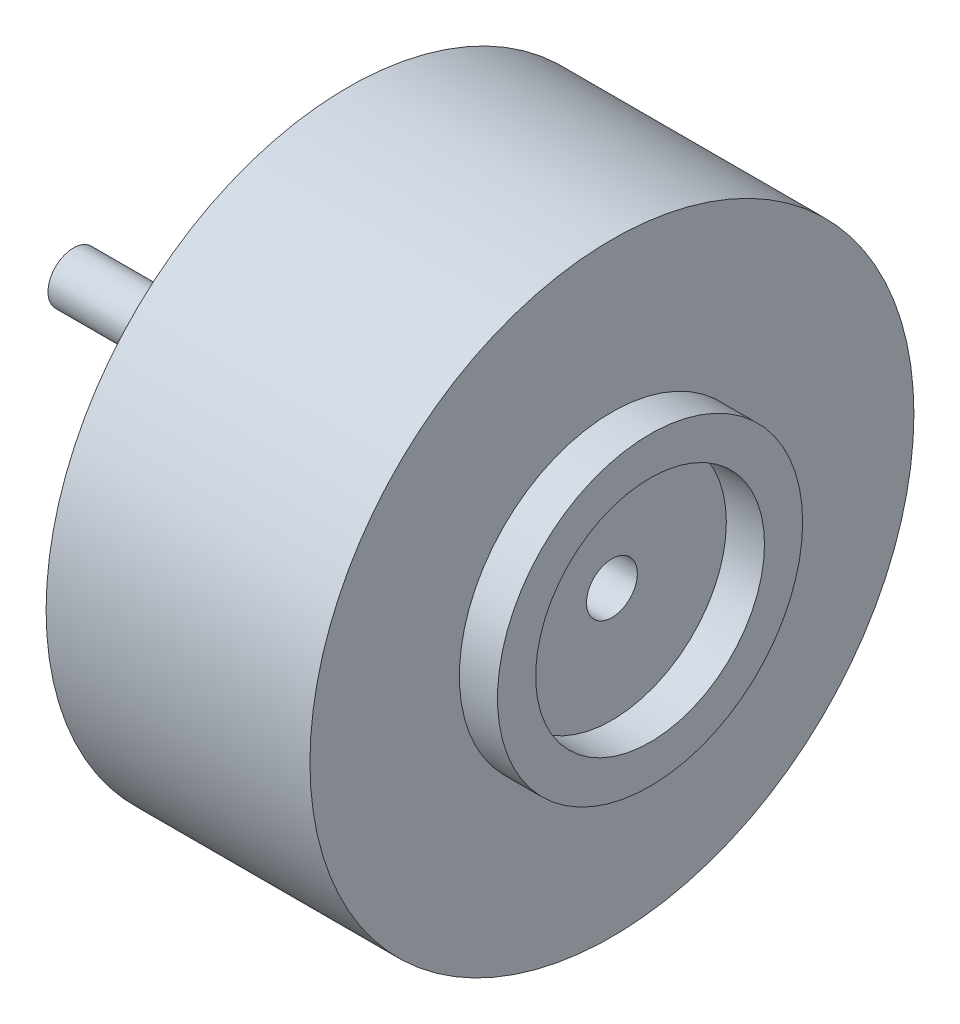
ISO-10303-21;
HEADER;
FILE_DESCRIPTION(('STEP AP214'),'2;1');
FILE_NAME('part.step','',(''),(''),'','','');
FILE_SCHEMA(('AUTOMOTIVE_DESIGN { 1 0 10303 214 1 1 1 1 }'));
ENDSEC;
DATA;
#1=APPLICATION_CONTEXT('core data for automotive mechanical design processes');
#2=APPLICATION_PROTOCOL_DEFINITION('international standard','automotive_design',2000,#1);
#3=PRODUCT_CONTEXT('',#1,'mechanical');
#4=PRODUCT('Part','Part','',(#3));
#5=PRODUCT_RELATED_PRODUCT_CATEGORY('part','',(#4));
#6=PRODUCT_DEFINITION_FORMATION('','',#4);
#7=PRODUCT_DEFINITION_CONTEXT('part definition',#1,'design');
#8=PRODUCT_DEFINITION('design','',#6,#7);
#9=PRODUCT_DEFINITION_SHAPE('','',#8);
#10=(LENGTH_UNIT() NAMED_UNIT(*) SI_UNIT(.MILLI.,.METRE.));
#11=(NAMED_UNIT(*) PLANE_ANGLE_UNIT() SI_UNIT($,.RADIAN.));
#12=(NAMED_UNIT(*) SI_UNIT($,.STERADIAN.) SOLID_ANGLE_UNIT());
#13=UNCERTAINTY_MEASURE_WITH_UNIT(LENGTH_MEASURE(1.E-05),#10,'distance_accuracy_value','');
#14=(GEOMETRIC_REPRESENTATION_CONTEXT(3) GLOBAL_UNCERTAINTY_ASSIGNED_CONTEXT((#13)) GLOBAL_UNIT_ASSIGNED_CONTEXT((#10,
#11,#12)) REPRESENTATION_CONTEXT('',''));
#15=CARTESIAN_POINT('',(0.,0.,0.));
#16=DIRECTION('',(0.,0.,1.));
#17=DIRECTION('',(1.,0.,0.));
#18=AXIS2_PLACEMENT_3D('',#15,#16,#17);
#19=CARTESIAN_POINT('',(-21.6,0.,0.));
#20=DIRECTION('',(1.,0.,0.));
#21=DIRECTION('',(0.,0.,-1.));
#22=AXIS2_PLACEMENT_3D('',#19,#20,#21);
#23=CYLINDRICAL_SURFACE('',#22,2.);
#24=CARTESIAN_POINT('',(-21.6,0.,0.));
#25=DIRECTION('',(1.,0.,0.));
#26=DIRECTION('',(0.,0.,-1.));
#27=AXIS2_PLACEMENT_3D('',#24,#25,#26);
#28=CIRCLE('',#27,2.);
#29=CARTESIAN_POINT('',(-21.6,0.,-2.));
#30=VERTEX_POINT('',#29);
#31=EDGE_CURVE('E11',#30,#30,#28,.T.);
#32=CARTESIAN_POINT('',(0.,0.,0.));
#33=DIRECTION('',(1.,0.,0.));
#34=DIRECTION('',(0.,0.,-1.));
#35=AXIS2_PLACEMENT_3D('',#32,#33,#34);
#36=CIRCLE('',#35,2.);
#37=CARTESIAN_POINT('',(0.,0.,-2.));
#38=VERTEX_POINT('',#37);
#39=EDGE_CURVE('E44',#38,#38,#36,.T.);
#40=CARTESIAN_POINT('',(-21.6,0.,-2.));
#41=CARTESIAN_POINT('',(-21.375,0.,-2.));
#42=CARTESIAN_POINT('',(-21.15,0.,-2.));
#43=CARTESIAN_POINT('',(-20.7,0.,-2.));
#44=CARTESIAN_POINT('',(-20.475,0.,-2.));
#45=CARTESIAN_POINT('',(-20.025,0.,-2.));
#46=CARTESIAN_POINT('',(-19.8,0.,-2.));
#47=CARTESIAN_POINT('',(-19.35,0.,-2.));
#48=CARTESIAN_POINT('',(-19.125,0.,-2.));
#49=CARTESIAN_POINT('',(-18.675,0.,-2.));
#50=CARTESIAN_POINT('',(-18.45,0.,-2.));
#51=CARTESIAN_POINT('',(-18.,0.,-2.));
#52=CARTESIAN_POINT('',(-17.775,0.,-2.));
#53=CARTESIAN_POINT('',(-17.325,0.,-2.));
#54=CARTESIAN_POINT('',(-17.1,0.,-2.));
#55=CARTESIAN_POINT('',(-16.65,0.,-2.));
#56=CARTESIAN_POINT('',(-16.425,0.,-2.));
#57=CARTESIAN_POINT('',(-15.975,0.,-2.));
#58=CARTESIAN_POINT('',(-15.75,0.,-2.));
#59=CARTESIAN_POINT('',(-15.3,0.,-2.));
#60=CARTESIAN_POINT('',(-15.075,0.,-2.));
#61=CARTESIAN_POINT('',(-14.625,0.,-2.));
#62=CARTESIAN_POINT('',(-14.4,0.,-2.));
#63=CARTESIAN_POINT('',(-13.95,0.,-2.));
#64=CARTESIAN_POINT('',(-13.725,0.,-2.));
#65=CARTESIAN_POINT('',(-13.275,0.,-2.));
#66=CARTESIAN_POINT('',(-13.05,0.,-2.));
#67=CARTESIAN_POINT('',(-12.6,0.,-2.));
#68=CARTESIAN_POINT('',(-12.375,0.,-2.));
#69=CARTESIAN_POINT('',(-11.925,0.,-2.));
#70=CARTESIAN_POINT('',(-11.7,0.,-2.));
#71=CARTESIAN_POINT('',(-11.25,0.,-2.));
#72=CARTESIAN_POINT('',(-11.025,0.,-2.));
#73=CARTESIAN_POINT('',(-10.575,0.,-2.));
#74=CARTESIAN_POINT('',(-10.35,0.,-2.));
#75=CARTESIAN_POINT('',(-9.9,0.,-2.));
#76=CARTESIAN_POINT('',(-9.675,0.,-2.));
#77=CARTESIAN_POINT('',(-9.225,0.,-2.));
#78=CARTESIAN_POINT('',(-9.,0.,-2.));
#79=CARTESIAN_POINT('',(-8.55,0.,-2.));
#80=CARTESIAN_POINT('',(-8.325,0.,-2.));
#81=CARTESIAN_POINT('',(-7.875,0.,-2.));
#82=CARTESIAN_POINT('',(-7.65,0.,-2.));
#83=CARTESIAN_POINT('',(-7.2,0.,-2.));
#84=CARTESIAN_POINT('',(-6.975,0.,-2.));
#85=CARTESIAN_POINT('',(-6.525,0.,-2.));
#86=CARTESIAN_POINT('',(-6.3,0.,-2.));
#87=CARTESIAN_POINT('',(-5.85,0.,-2.));
#88=CARTESIAN_POINT('',(-5.62500000000001,0.,-2.));
#89=CARTESIAN_POINT('',(-5.17500000000001,0.,-2.));
#90=CARTESIAN_POINT('',(-4.95,0.,-2.));
#91=CARTESIAN_POINT('',(-4.5,0.,-2.));
#92=CARTESIAN_POINT('',(-4.275,0.,-2.));
#93=CARTESIAN_POINT('',(-3.825,0.,-2.));
#94=CARTESIAN_POINT('',(-3.6,0.,-2.));
#95=CARTESIAN_POINT('',(-3.15,0.,-2.));
#96=CARTESIAN_POINT('',(-2.925,0.,-2.));
#97=CARTESIAN_POINT('',(-2.475,0.,-2.));
#98=CARTESIAN_POINT('',(-2.25,0.,-2.));
#99=CARTESIAN_POINT('',(-1.8,0.,-2.));
#100=CARTESIAN_POINT('',(-1.575,0.,-2.));
#101=CARTESIAN_POINT('',(-1.125,0.,-2.));
#102=CARTESIAN_POINT('',(-0.900000000000003,0.,-2.));
#103=CARTESIAN_POINT('',(-0.450000000000002,0.,-2.));
#104=CARTESIAN_POINT('',(-0.225000000000003,0.,-2.));
#105=CARTESIAN_POINT('',(0.,0.,-2.));
#106=B_SPLINE_CURVE_WITH_KNOTS('',3,(#40,#41,#42,#43,#44,#45,#46,#47,#48,#49,#50,#51,#52,#53,
#54,#55,#56,#57,#58,#59,#60,#61,#62,#63,#64,#65,#66,#67,#68,#69,#70,#71,#72,#73,#74,#75,#76,#77,
#78,#79,#80,#81,#82,#83,#84,#85,#86,#87,#88,#89,#90,#91,#92,#93,#94,#95,#96,#97,#98,#99,#100,
#101,#102,#103,#104,#105),.UNSPECIFIED.,.F.,.F.,(4,2,2,2,2,2,2,2,2,2,2,2,2,2,2,2,2,2,2,2,2,2,2,
2,2,2,2,2,2,2,2,2,4),(0.,0.674999999999998,1.35,2.025,2.7,3.375,4.05,4.725,5.4,6.075,6.75,7.425,
8.1,8.775,9.45,10.125,10.8,11.475,12.15,12.825,13.5,14.175,14.85,15.525,16.2,16.875,17.55,
18.225,18.9,19.575,20.25,20.925,21.6),.UNSPECIFIED.);
#107=EDGE_CURVE('BSEAM41',#30,#38,#106,.T.);
#108=ORIENTED_EDGE('',*,*,#31,.T.);
#109=ORIENTED_EDGE('',*,*,#39,.F.);
#110=ORIENTED_EDGE('',*,*,#107,.T.);
#111=ORIENTED_EDGE('',*,*,#107,.F.);
#112=EDGE_LOOP('',(#108,#110,#109,#111));
#113=FACE_BOUND('',#112,.T.);
#114=ADVANCED_FACE('F41',(#113),#23,.T.);
#115=CARTESIAN_POINT('',(-21.6,0.,0.));
#116=DIRECTION('',(1.,0.,0.));
#117=DIRECTION('',(0.,0.,-1.));
#118=AXIS2_PLACEMENT_3D('',#115,#116,#117);
#119=PLANE('',#118);
#120=CARTESIAN_POINT('',(-21.6,0.,0.));
#121=DIRECTION('',(1.,0.,0.));
#122=DIRECTION('',(0.,0.,-1.));
#123=AXIS2_PLACEMENT_3D('',#120,#121,#122);
#124=CIRCLE('',#123,1.);
#125=CARTESIAN_POINT('',(-21.6,0.,-1.));
#126=VERTEX_POINT('',#125);
#127=EDGE_CURVE('E51',#126,#126,#124,.T.);
#128=ORIENTED_EDGE('',*,*,#127,.T.);
#129=EDGE_LOOP('',(#128));
#130=FACE_BOUND('',#129,.T.);
#131=ORIENTED_EDGE('',*,*,#31,.F.);
#132=EDGE_LOOP('',(#131));
#133=FACE_BOUND('',#132,.T.);
#134=ADVANCED_FACE('F59',(#130,#133),#119,.F.);
#135=CARTESIAN_POINT('',(0.,0.,0.));
#136=DIRECTION('',(1.,0.,0.));
#137=DIRECTION('',(0.,0.,-1.));
#138=AXIS2_PLACEMENT_3D('',#135,#136,#137);
#139=PLANE('',#138);
#140=CARTESIAN_POINT('',(0.,0.,0.));
#141=DIRECTION('',(1.,0.,0.));
#142=DIRECTION('',(0.,0.,-1.));
#143=AXIS2_PLACEMENT_3D('',#140,#141,#142);
#144=CIRCLE('',#143,1.);
#145=CARTESIAN_POINT('',(0.,0.,-1.));
#146=VERTEX_POINT('',#145);
#147=EDGE_CURVE('E53',#146,#146,#144,.T.);
#148=ORIENTED_EDGE('',*,*,#147,.F.);
#149=EDGE_LOOP('',(#148));
#150=FACE_BOUND('',#149,.T.);
#151=ORIENTED_EDGE('',*,*,#39,.T.);
#152=EDGE_LOOP('',(#151));
#153=FACE_BOUND('',#152,.T.);
#154=ADVANCED_FACE('F65',(#150,#153),#139,.T.);
#155=CARTESIAN_POINT('',(-21.6,0.,0.));
#156=DIRECTION('',(1.,0.,0.));
#157=DIRECTION('',(0.,0.,-1.));
#158=AXIS2_PLACEMENT_3D('',#155,#156,#157);
#159=CYLINDRICAL_SURFACE('',#158,1.);
#160=CARTESIAN_POINT('',(-21.6,0.,-1.));
#161=CARTESIAN_POINT('',(-21.375,0.,-1.));
#162=CARTESIAN_POINT('',(-21.15,0.,-1.));
#163=CARTESIAN_POINT('',(-20.7,0.,-1.));
#164=CARTESIAN_POINT('',(-20.475,0.,-1.));
#165=CARTESIAN_POINT('',(-20.025,0.,-1.));
#166=CARTESIAN_POINT('',(-19.8,0.,-1.));
#167=CARTESIAN_POINT('',(-19.35,0.,-1.));
#168=CARTESIAN_POINT('',(-19.125,0.,-1.));
#169=CARTESIAN_POINT('',(-18.675,0.,-1.));
#170=CARTESIAN_POINT('',(-18.45,0.,-1.));
#171=CARTESIAN_POINT('',(-18.,0.,-1.));
#172=CARTESIAN_POINT('',(-17.775,0.,-1.));
#173=CARTESIAN_POINT('',(-17.325,0.,-1.));
#174=CARTESIAN_POINT('',(-17.1,0.,-1.));
#175=CARTESIAN_POINT('',(-16.65,0.,-1.));
#176=CARTESIAN_POINT('',(-16.425,0.,-1.));
#177=CARTESIAN_POINT('',(-15.975,0.,-1.));
#178=CARTESIAN_POINT('',(-15.75,0.,-1.));
#179=CARTESIAN_POINT('',(-15.3,0.,-1.));
#180=CARTESIAN_POINT('',(-15.075,0.,-1.));
#181=CARTESIAN_POINT('',(-14.625,0.,-1.));
#182=CARTESIAN_POINT('',(-14.4,0.,-1.));
#183=CARTESIAN_POINT('',(-13.95,0.,-1.));
#184=CARTESIAN_POINT('',(-13.725,0.,-1.));
#185=CARTESIAN_POINT('',(-13.275,0.,-1.));
#186=CARTESIAN_POINT('',(-13.05,0.,-1.));
#187=CARTESIAN_POINT('',(-12.6,0.,-1.));
#188=CARTESIAN_POINT('',(-12.375,0.,-1.));
#189=CARTESIAN_POINT('',(-11.925,0.,-1.));
#190=CARTESIAN_POINT('',(-11.7,0.,-1.));
#191=CARTESIAN_POINT('',(-11.25,0.,-1.));
#192=CARTESIAN_POINT('',(-11.025,0.,-1.));
#193=CARTESIAN_POINT('',(-10.575,0.,-1.));
#194=CARTESIAN_POINT('',(-10.35,0.,-1.));
#195=CARTESIAN_POINT('',(-9.9,0.,-1.));
#196=CARTESIAN_POINT('',(-9.675,0.,-1.));
#197=CARTESIAN_POINT('',(-9.225,0.,-1.));
#198=CARTESIAN_POINT('',(-9.,0.,-1.));
#199=CARTESIAN_POINT('',(-8.55,0.,-1.));
#200=CARTESIAN_POINT('',(-8.325,0.,-1.));
#201=CARTESIAN_POINT('',(-7.875,0.,-1.));
#202=CARTESIAN_POINT('',(-7.65,0.,-1.));
#203=CARTESIAN_POINT('',(-7.2,0.,-1.));
#204=CARTESIAN_POINT('',(-6.975,0.,-1.));
#205=CARTESIAN_POINT('',(-6.525,0.,-1.));
#206=CARTESIAN_POINT('',(-6.3,0.,-1.));
#207=CARTESIAN_POINT('',(-5.85,0.,-1.));
#208=CARTESIAN_POINT('',(-5.62500000000001,0.,-1.));
#209=CARTESIAN_POINT('',(-5.17500000000001,0.,-1.));
#210=CARTESIAN_POINT('',(-4.95,0.,-1.));
#211=CARTESIAN_POINT('',(-4.5,0.,-1.));
#212=CARTESIAN_POINT('',(-4.275,0.,-1.));
#213=CARTESIAN_POINT('',(-3.825,0.,-1.));
#214=CARTESIAN_POINT('',(-3.6,0.,-1.));
#215=CARTESIAN_POINT('',(-3.15,0.,-1.));
#216=CARTESIAN_POINT('',(-2.925,0.,-1.));
#217=CARTESIAN_POINT('',(-2.475,0.,-1.));
#218=CARTESIAN_POINT('',(-2.25,0.,-1.));
#219=CARTESIAN_POINT('',(-1.8,0.,-1.));
#220=CARTESIAN_POINT('',(-1.575,0.,-1.));
#221=CARTESIAN_POINT('',(-1.125,0.,-1.));
#222=CARTESIAN_POINT('',(-0.900000000000003,0.,-1.));
#223=CARTESIAN_POINT('',(-0.450000000000002,0.,-1.));
#224=CARTESIAN_POINT('',(-0.225000000000003,0.,-1.));
#225=CARTESIAN_POINT('',(0.,0.,-1.));
#226=B_SPLINE_CURVE_WITH_KNOTS('',3,(#160,#161,#162,#163,#164,#165,#166,#167,#168,#169,#170,
#171,#172,#173,#174,#175,#176,#177,#178,#179,#180,#181,#182,#183,#184,#185,#186,#187,#188,#189,
#190,#191,#192,#193,#194,#195,#196,#197,#198,#199,#200,#201,#202,#203,#204,#205,#206,#207,#208,
#209,#210,#211,#212,#213,#214,#215,#216,#217,#218,#219,#220,#221,#222,#223,#224,#225),
.UNSPECIFIED.,.F.,.F.,(4,2,2,2,2,2,2,2,2,2,2,2,2,2,2,2,2,2,2,2,2,2,2,2,2,2,2,2,2,2,2,2,4),(0.,
0.674999999999998,1.35,2.025,2.7,3.375,4.05,4.725,5.4,6.075,6.75,7.425,8.1,8.775,9.45,10.125,
10.8,11.475,12.15,12.825,13.5,14.175,14.85,15.525,16.2,16.875,17.55,18.225,18.9,19.575,20.25,
20.925,21.6),.UNSPECIFIED.);
#227=EDGE_CURVE('BSEAM62',#126,#146,#226,.T.);
#228=ORIENTED_EDGE('',*,*,#127,.F.);
#229=ORIENTED_EDGE('',*,*,#147,.T.);
#230=ORIENTED_EDGE('',*,*,#227,.T.);
#231=ORIENTED_EDGE('',*,*,#227,.F.);
#232=EDGE_LOOP('',(#228,#230,#229,#231));
#233=FACE_BOUND('',#232,.T.);
#234=ADVANCED_FACE('F62',(#233),#159,.F.);
#235=CLOSED_SHELL('',(#114,#134,#154,#234));
#236=MANIFOLD_SOLID_BREP('B2',#235);
#237=CARTESIAN_POINT('',(0.,0.,0.));
#238=DIRECTION('',(1.,0.,0.));
#239=DIRECTION('',(0.,0.,-1.));
#240=AXIS2_PLACEMENT_3D('',#237,#238,#239);
#241=PLANE('',#240);
#242=CARTESIAN_POINT('',(0.,0.,0.));
#243=DIRECTION('',(1.,0.,0.));
#244=DIRECTION('',(0.,0.,-1.));
#245=AXIS2_PLACEMENT_3D('',#242,#243,#244);
#246=CIRCLE('',#245,2.);
#247=CARTESIAN_POINT('',(0.,0.,-2.));
#248=VERTEX_POINT('',#247);
#249=EDGE_CURVE('E122',#248,#248,#246,.T.);
#250=ORIENTED_EDGE('',*,*,#249,.T.);
#251=EDGE_LOOP('',(#250));
#252=FACE_BOUND('',#251,.T.);
#253=CARTESIAN_POINT('',(0.,0.,0.));
#254=DIRECTION('',(1.,0.,0.));
#255=DIRECTION('',(0.,0.,-1.));
#256=AXIS2_PLACEMENT_3D('',#253,#254,#255);
#257=CIRCLE('',#256,9.);
#258=CARTESIAN_POINT('',(0.,0.,-9.));
#259=VERTEX_POINT('',#258);
#260=EDGE_CURVE('E40',#259,#259,#257,.T.);
#261=ORIENTED_EDGE('',*,*,#260,.F.);
#262=EDGE_LOOP('',(#261));
#263=FACE_BOUND('',#262,.T.);
#264=ADVANCED_FACE('F103',(#252,#263),#241,.F.);
#265=CARTESIAN_POINT('',(20.75,0.,0.));
#266=DIRECTION('',(1.,0.,0.));
#267=DIRECTION('',(0.,0.,-1.));
#268=AXIS2_PLACEMENT_3D('',#265,#266,#267);
#269=PLANE('',#268);
#270=CARTESIAN_POINT('',(20.75,0.,0.));
#271=DIRECTION('',(1.,0.,0.));
#272=DIRECTION('',(0.,0.,-1.));
#273=AXIS2_PLACEMENT_3D('',#270,#271,#272);
#274=CIRCLE('',#273,2.);
#275=CARTESIAN_POINT('',(20.75,0.,-2.));
#276=VERTEX_POINT('',#275);
#277=EDGE_CURVE('E124',#276,#276,#274,.T.);
#278=ORIENTED_EDGE('',*,*,#277,.F.);
#279=EDGE_LOOP('',(#278));
#280=FACE_BOUND('',#279,.T.);
#281=CARTESIAN_POINT('',(20.75,0.,0.));
#282=DIRECTION('',(1.,0.,0.));
#283=DIRECTION('',(0.,0.,-1.));
#284=AXIS2_PLACEMENT_3D('',#281,#282,#283);
#285=CIRCLE('',#284,9.);
#286=CARTESIAN_POINT('',(20.75,0.,-9.));
#287=VERTEX_POINT('',#286);
#288=EDGE_CURVE('E110',#287,#287,#285,.F.);
#289=ORIENTED_EDGE('',*,*,#288,.F.);
#290=EDGE_LOOP('',(#289));
#291=FACE_BOUND('',#290,.T.);
#292=ADVANCED_FACE('F160',(#280,#291),#269,.T.);
#293=CARTESIAN_POINT('',(20.75,0.,0.));
#294=DIRECTION('',(1.,0.,0.));
#295=DIRECTION('',(0.,0.,-1.));
#296=AXIS2_PLACEMENT_3D('',#293,#294,#295);
#297=CIRCLE('',#296,12.);
#298=CARTESIAN_POINT('',(20.75,0.,-12.));
#299=VERTEX_POINT('',#298);
#300=EDGE_CURVE('E130',#299,#299,#297,.T.);
#301=ORIENTED_EDGE('',*,*,#300,.F.);
#302=EDGE_LOOP('',(#301));
#303=FACE_BOUND('',#302,.T.);
#304=CARTESIAN_POINT('',(20.75,0.,0.));
#305=DIRECTION('',(1.,0.,0.));
#306=DIRECTION('',(0.,0.,-1.));
#307=AXIS2_PLACEMENT_3D('',#304,#305,#306);
#308=CIRCLE('',#307,23.75);
#309=CARTESIAN_POINT('',(20.75,0.,-23.75));
#310=VERTEX_POINT('',#309);
#311=EDGE_CURVE('E114',#310,#310,#308,.T.);
#312=ORIENTED_EDGE('',*,*,#311,.T.);
#313=EDGE_LOOP('',(#312));
#314=FACE_BOUND('',#313,.T.);
#315=ADVANCED_FACE('F166',(#303,#314),#269,.T.);
#316=CARTESIAN_POINT('',(0.,0.,0.));
#317=DIRECTION('',(1.,0.,0.));
#318=DIRECTION('',(0.,0.,-1.));
#319=AXIS2_PLACEMENT_3D('',#316,#317,#318);
#320=CIRCLE('',#319,12.);
#321=CARTESIAN_POINT('',(0.,0.,-12.));
#322=VERTEX_POINT('',#321);
#323=EDGE_CURVE('E139',#322,#322,#320,.T.);
#324=ORIENTED_EDGE('',*,*,#323,.T.);
#325=EDGE_LOOP('',(#324));
#326=FACE_BOUND('',#325,.T.);
#327=CARTESIAN_POINT('',(0.,0.,0.));
#328=DIRECTION('',(1.,0.,0.));
#329=DIRECTION('',(0.,0.,-1.));
#330=AXIS2_PLACEMENT_3D('',#327,#328,#329);
#331=CIRCLE('',#330,23.75);
#332=CARTESIAN_POINT('',(0.,0.,-23.75));
#333=VERTEX_POINT('',#332);
#334=EDGE_CURVE('E118',#333,#333,#331,.T.);
#335=ORIENTED_EDGE('',*,*,#334,.F.);
#336=EDGE_LOOP('',(#335));
#337=FACE_BOUND('',#336,.T.);
#338=ADVANCED_FACE('F162',(#326,#337),#241,.F.);
#339=CARTESIAN_POINT('',(20.75,0.,0.));
#340=DIRECTION('',(-1.,0.,0.));
#341=DIRECTION('',(0.,0.,1.));
#342=AXIS2_PLACEMENT_3D('',#339,#340,#341);
#343=CYLINDRICAL_SURFACE('',#342,23.75);
#344=ORIENTED_EDGE('',*,*,#311,.F.);
#345=EDGE_LOOP('',(#344));
#346=FACE_BOUND('',#345,.T.);
#347=ORIENTED_EDGE('',*,*,#334,.T.);
#348=EDGE_LOOP('',(#347));
#349=FACE_BOUND('',#348,.T.);
#350=ADVANCED_FACE('F105',(#346,#349),#343,.T.);
#351=CARTESIAN_POINT('',(0.,0.,0.));
#352=DIRECTION('',(1.,0.,0.));
#353=DIRECTION('',(0.,0.,-1.));
#354=AXIS2_PLACEMENT_3D('',#351,#352,#353);
#355=CYLINDRICAL_SURFACE('',#354,2.);
#356=ORIENTED_EDGE('',*,*,#249,.F.);
#357=EDGE_LOOP('',(#356));
#358=FACE_BOUND('',#357,.T.);
#359=ORIENTED_EDGE('',*,*,#277,.T.);
#360=EDGE_LOOP('',(#359));
#361=FACE_BOUND('',#360,.T.);
#362=ADVANCED_FACE('F176',(#358,#361),#355,.F.);
#363=CARTESIAN_POINT('',(23.75,0.,0.));
#364=DIRECTION('',(1.,0.,0.));
#365=DIRECTION('',(0.,0.,-1.));
#366=AXIS2_PLACEMENT_3D('',#363,#364,#365);
#367=PLANE('',#366);
#368=CARTESIAN_POINT('',(23.75,0.,0.));
#369=DIRECTION('',(1.,0.,0.));
#370=DIRECTION('',(0.,0.,-1.));
#371=AXIS2_PLACEMENT_3D('',#368,#369,#370);
#372=CIRCLE('',#371,12.);
#373=CARTESIAN_POINT('',(23.75,0.,-12.));
#374=VERTEX_POINT('',#373);
#375=EDGE_CURVE('E127',#374,#374,#372,.T.);
#376=ORIENTED_EDGE('',*,*,#375,.T.);
#377=EDGE_LOOP('',(#376));
#378=FACE_BOUND('',#377,.T.);
#379=CARTESIAN_POINT('',(23.75,0.,0.));
#380=DIRECTION('',(1.,0.,0.));
#381=DIRECTION('',(0.,0.,-1.));
#382=AXIS2_PLACEMENT_3D('',#379,#380,#381);
#383=CIRCLE('',#382,9.);
#384=CARTESIAN_POINT('',(23.75,0.,-9.));
#385=VERTEX_POINT('',#384);
#386=EDGE_CURVE('E133',#385,#385,#383,.T.);
#387=ORIENTED_EDGE('',*,*,#386,.F.);
#388=EDGE_LOOP('',(#387));
#389=FACE_BOUND('',#388,.T.);
#390=ADVANCED_FACE('F195',(#378,#389),#367,.T.);
#391=CARTESIAN_POINT('',(23.75,0.,0.));
#392=DIRECTION('',(-1.,0.,0.));
#393=DIRECTION('',(0.,0.,1.));
#394=AXIS2_PLACEMENT_3D('',#391,#392,#393);
#395=CYLINDRICAL_SURFACE('',#394,12.);
#396=ORIENTED_EDGE('',*,*,#375,.F.);
#397=EDGE_LOOP('',(#396));
#398=FACE_BOUND('',#397,.T.);
#399=ORIENTED_EDGE('',*,*,#300,.T.);
#400=EDGE_LOOP('',(#399));
#401=FACE_BOUND('',#400,.T.);
#402=ADVANCED_FACE('F191',(#398,#401),#395,.T.);
#403=CARTESIAN_POINT('',(23.75,0.,0.));
#404=DIRECTION('',(-1.,0.,0.));
#405=DIRECTION('',(0.,0.,1.));
#406=AXIS2_PLACEMENT_3D('',#403,#404,#405);
#407=CYLINDRICAL_SURFACE('',#406,9.);
#408=ORIENTED_EDGE('',*,*,#386,.T.);
#409=EDGE_LOOP('',(#408));
#410=FACE_BOUND('',#409,.T.);
#411=ORIENTED_EDGE('',*,*,#288,.T.);
#412=EDGE_LOOP('',(#411));
#413=FACE_BOUND('',#412,.T.);
#414=ADVANCED_FACE('F185',(#410,#413),#407,.F.);
#415=CARTESIAN_POINT('',(-3.,0.,0.));
#416=DIRECTION('',(1.,0.,0.));
#417=DIRECTION('',(0.,0.,-1.));
#418=AXIS2_PLACEMENT_3D('',#415,#416,#417);
#419=CYLINDRICAL_SURFACE('',#418,12.);
#420=CARTESIAN_POINT('',(-3.,0.,0.));
#421=DIRECTION('',(1.,0.,0.));
#422=DIRECTION('',(0.,0.,-1.));
#423=AXIS2_PLACEMENT_3D('',#420,#421,#422);
#424=CIRCLE('',#423,12.);
#425=CARTESIAN_POINT('',(-3.,0.,-12.));
#426=VERTEX_POINT('',#425);
#427=EDGE_CURVE('E138',#426,#426,#424,.T.);
#428=ORIENTED_EDGE('',*,*,#427,.T.);
#429=EDGE_LOOP('',(#428));
#430=FACE_BOUND('',#429,.T.);
#431=ORIENTED_EDGE('',*,*,#323,.F.);
#432=EDGE_LOOP('',(#431));
#433=FACE_BOUND('',#432,.T.);
#434=ADVANCED_FACE('F157',(#430,#433),#419,.T.);
#435=CARTESIAN_POINT('',(-3.,0.,0.));
#436=DIRECTION('',(1.,0.,0.));
#437=DIRECTION('',(0.,0.,-1.));
#438=AXIS2_PLACEMENT_3D('',#435,#436,#437);
#439=PLANE('',#438);
#440=CARTESIAN_POINT('',(-3.,0.,0.));
#441=DIRECTION('',(1.,0.,0.));
#442=DIRECTION('',(0.,0.,-1.));
#443=AXIS2_PLACEMENT_3D('',#440,#441,#442);
#444=CIRCLE('',#443,9.);
#445=CARTESIAN_POINT('',(-3.,0.,-9.));
#446=VERTEX_POINT('',#445);
#447=EDGE_CURVE('E142',#446,#446,#444,.T.);
#448=ORIENTED_EDGE('',*,*,#447,.T.);
#449=EDGE_LOOP('',(#448));
#450=FACE_BOUND('',#449,.T.);
#451=ORIENTED_EDGE('',*,*,#427,.F.);
#452=EDGE_LOOP('',(#451));
#453=FACE_BOUND('',#452,.T.);
#454=ADVANCED_FACE('F148',(#450,#453),#439,.F.);
#455=CARTESIAN_POINT('',(-3.,0.,0.));
#456=DIRECTION('',(1.,0.,0.));
#457=DIRECTION('',(0.,0.,-1.));
#458=AXIS2_PLACEMENT_3D('',#455,#456,#457);
#459=CYLINDRICAL_SURFACE('',#458,9.);
#460=ORIENTED_EDGE('',*,*,#447,.F.);
#461=EDGE_LOOP('',(#460));
#462=FACE_BOUND('',#461,.T.);
#463=ORIENTED_EDGE('',*,*,#260,.T.);
#464=EDGE_LOOP('',(#463));
#465=FACE_BOUND('',#464,.T.);
#466=ADVANCED_FACE('F151',(#462,#465),#459,.F.);
#467=CLOSED_SHELL('',(#264,#292,#315,#338,#350,#362,#390,#402,#414,#434,#454,#466));
#468=MANIFOLD_SOLID_BREP('B6',#467);
#469=ADVANCED_BREP_SHAPE_REPRESENTATION('',(#18,#236,#468),#14);
#470=SHAPE_DEFINITION_REPRESENTATION(#9,#469);
ENDSEC;
END-ISO-10303-21;
